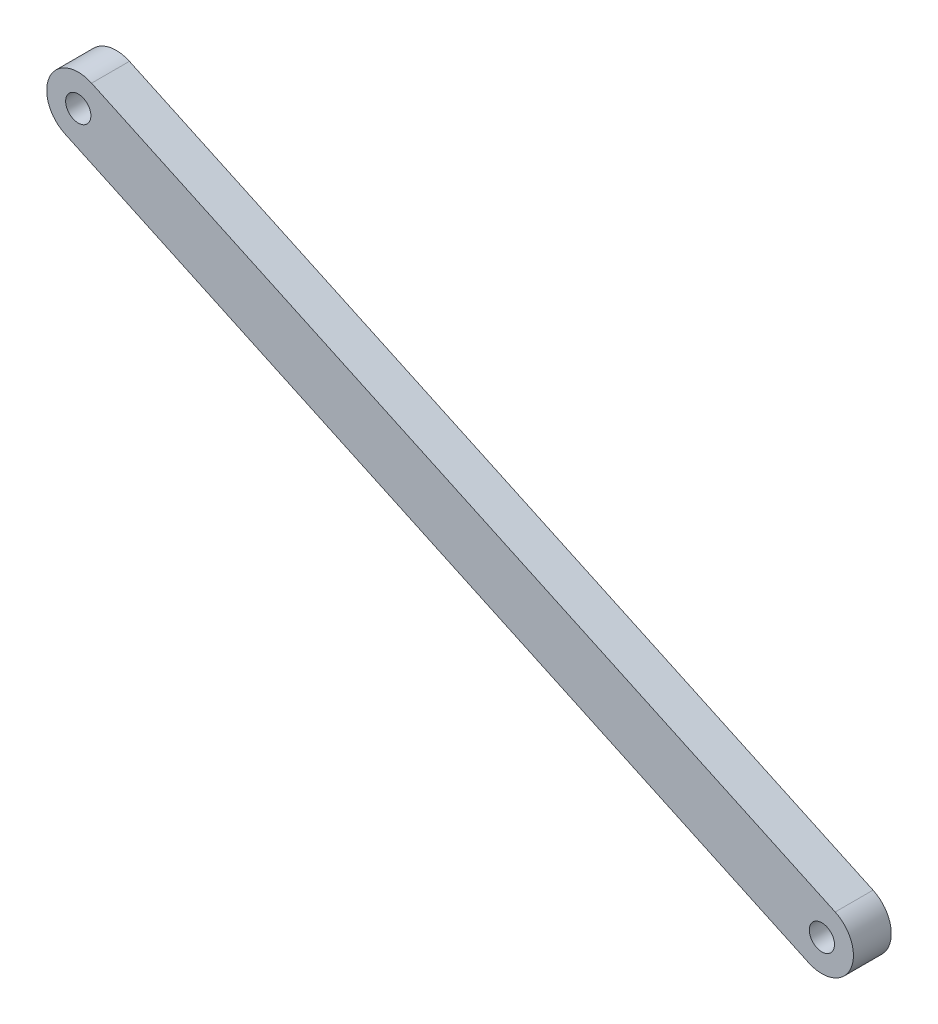
ISO-10303-21;
HEADER;
FILE_DESCRIPTION(('STEP AP214'),'2;1');
FILE_NAME('part.step','',(''),(''),'','','');
FILE_SCHEMA(('AUTOMOTIVE_DESIGN { 1 0 10303 214 1 1 1 1 }'));
ENDSEC;
DATA;
#1=APPLICATION_CONTEXT('core data for automotive mechanical design processes');
#2=APPLICATION_PROTOCOL_DEFINITION('international standard','automotive_design',2000,#1);
#3=PRODUCT_CONTEXT('',#1,'mechanical');
#4=PRODUCT('Part','Part','',(#3));
#5=PRODUCT_RELATED_PRODUCT_CATEGORY('part','',(#4));
#6=PRODUCT_DEFINITION_FORMATION('','',#4);
#7=PRODUCT_DEFINITION_CONTEXT('part definition',#1,'design');
#8=PRODUCT_DEFINITION('design','',#6,#7);
#9=PRODUCT_DEFINITION_SHAPE('','',#8);
#10=(LENGTH_UNIT() NAMED_UNIT(*) SI_UNIT(.MILLI.,.METRE.));
#11=(NAMED_UNIT(*) PLANE_ANGLE_UNIT() SI_UNIT($,.RADIAN.));
#12=(NAMED_UNIT(*) SI_UNIT($,.STERADIAN.) SOLID_ANGLE_UNIT());
#13=UNCERTAINTY_MEASURE_WITH_UNIT(LENGTH_MEASURE(1.E-05),#10,'distance_accuracy_value','');
#14=(GEOMETRIC_REPRESENTATION_CONTEXT(3) GLOBAL_UNCERTAINTY_ASSIGNED_CONTEXT((#13)) GLOBAL_UNIT_ASSIGNED_CONTEXT((#10,
#11,#12)) REPRESENTATION_CONTEXT('',''));
#15=CARTESIAN_POINT('',(0.,0.,0.));
#16=DIRECTION('',(0.,0.,1.));
#17=DIRECTION('',(1.,0.,0.));
#18=AXIS2_PLACEMENT_3D('',#15,#16,#17);
#19=CARTESIAN_POINT('',(-20.6555406612858,56.1798703776775,3.));
#20=DIRECTION('',(0.,0.,1.));
#21=DIRECTION('',(1.,0.,0.));
#22=AXIS2_PLACEMENT_3D('',#19,#20,#21);
#23=PLANE('',#22);
#24=CARTESIAN_POINT('',(38.2786541053352,28.7616157430369,3.));
#25=DIRECTION('',(0.,0.,1.));
#26=DIRECTION('',(1.,0.,0.));
#27=AXIS2_PLACEMENT_3D('',#24,#25,#26);
#28=CIRCLE('',#27,0.999999999999998);
#29=CARTESIAN_POINT('',(39.2786541053352,28.7616157430369,3.));
#30=VERTEX_POINT('',#29);
#31=EDGE_CURVE('E102',#30,#30,#28,.T.);
#32=ORIENTED_EDGE('',*,*,#31,.F.);
#33=EDGE_LOOP('',(#32));
#34=FACE_BOUND('',#33,.T.);
#35=CARTESIAN_POINT('',(-20.6555406612858,56.1798703776775,3.));
#36=DIRECTION('',(0.,0.,1.));
#37=DIRECTION('',(1.,0.,0.));
#38=AXIS2_PLACEMENT_3D('',#35,#36,#37);
#39=CIRCLE('',#38,2.50000000000001);
#40=CARTESIAN_POINT('',(-19.6009924061073,58.4465701763937,3.));
#41=VERTEX_POINT('',#40);
#42=CARTESIAN_POINT('',(-21.7100889164642,53.9131705789614,3.));
#43=VERTEX_POINT('',#42);
#44=EDGE_CURVE('E87',#41,#43,#39,.T.);
#45=ORIENTED_EDGE('',*,*,#44,.T.);
#46=DIRECTION('',(0.906679919486476,-0.421819302071394,0.));
#47=VECTOR('',#46,1.);
#48=CARTESIAN_POINT('',(-21.7100889164642,53.9131705789614,3.));
#49=LINE('',#48,#47);
#50=CARTESIAN_POINT('',(37.2241058501567,26.4949159443207,3.));
#51=VERTEX_POINT('',#50);
#52=EDGE_CURVE('E82',#43,#51,#49,.T.);
#53=ORIENTED_EDGE('',*,*,#52,.T.);
#54=CARTESIAN_POINT('',(38.2786541053352,28.7616157430369,3.));
#55=DIRECTION('',(0.,0.,1.));
#56=DIRECTION('',(1.,0.,0.));
#57=AXIS2_PLACEMENT_3D('',#54,#55,#56);
#58=CIRCLE('',#57,2.50000000000001);
#59=CARTESIAN_POINT('',(39.3332023605137,31.0283155417531,3.));
#60=VERTEX_POINT('',#59);
#61=EDGE_CURVE('E85',#51,#60,#58,.T.);
#62=ORIENTED_EDGE('',*,*,#61,.T.);
#63=DIRECTION('',(-0.906679919486476,0.421819302071394,0.));
#64=VECTOR('',#63,1.);
#65=CARTESIAN_POINT('',(-19.6009924061073,58.4465701763937,3.));
#66=LINE('',#65,#64);
#67=EDGE_CURVE('E52',#60,#41,#66,.T.);
#68=ORIENTED_EDGE('',*,*,#67,.T.);
#69=EDGE_LOOP('',(#45,#53,#62,#68));
#70=FACE_BOUND('',#69,.T.);
#71=CARTESIAN_POINT('',(-20.6555406612858,56.1798703776775,3.));
#72=DIRECTION('',(0.,0.,1.));
#73=DIRECTION('',(1.,0.,0.));
#74=AXIS2_PLACEMENT_3D('',#71,#72,#73);
#75=CIRCLE('',#74,0.999999999999998);
#76=CARTESIAN_POINT('',(-19.6555406612858,56.1798703776775,3.));
#77=VERTEX_POINT('',#76);
#78=EDGE_CURVE('E117',#77,#77,#75,.T.);
#79=ORIENTED_EDGE('',*,*,#78,.F.);
#80=EDGE_LOOP('',(#79));
#81=FACE_BOUND('',#80,.T.);
#82=ADVANCED_FACE('F35',(#34,#70,#81),#23,.T.);
#83=CARTESIAN_POINT('',(-20.6555406612858,56.1798703776775,0.));
#84=DIRECTION('',(0.,0.,1.));
#85=DIRECTION('',(1.,0.,0.));
#86=AXIS2_PLACEMENT_3D('',#83,#84,#85);
#87=PLANE('',#86);
#88=CARTESIAN_POINT('',(-20.6555406612858,56.1798703776775,0.));
#89=DIRECTION('',(0.,0.,1.));
#90=DIRECTION('',(1.,0.,0.));
#91=AXIS2_PLACEMENT_3D('',#88,#89,#90);
#92=CIRCLE('',#91,2.50000000000001);
#93=CARTESIAN_POINT('',(-19.6009924061073,58.4465701763937,0.));
#94=VERTEX_POINT('',#93);
#95=CARTESIAN_POINT('',(-21.7100889164642,53.9131705789614,0.));
#96=VERTEX_POINT('',#95);
#97=EDGE_CURVE('E99',#94,#96,#92,.T.);
#98=ORIENTED_EDGE('',*,*,#97,.F.);
#99=DIRECTION('',(-0.906679919486476,0.421819302071394,0.));
#100=VECTOR('',#99,1.);
#101=CARTESIAN_POINT('',(-19.6009924061073,58.4465701763937,0.));
#102=LINE('',#101,#100);
#103=CARTESIAN_POINT('',(39.3332023605137,31.0283155417531,0.));
#104=VERTEX_POINT('',#103);
#105=EDGE_CURVE('E75',#104,#94,#102,.T.);
#106=ORIENTED_EDGE('',*,*,#105,.F.);
#107=CARTESIAN_POINT('',(38.2786541053352,28.7616157430369,0.));
#108=DIRECTION('',(0.,0.,1.));
#109=DIRECTION('',(1.,0.,0.));
#110=AXIS2_PLACEMENT_3D('',#107,#108,#109);
#111=CIRCLE('',#110,2.50000000000001);
#112=CARTESIAN_POINT('',(37.2241058501567,26.4949159443207,0.));
#113=VERTEX_POINT('',#112);
#114=EDGE_CURVE('E69',#113,#104,#111,.T.);
#115=ORIENTED_EDGE('',*,*,#114,.F.);
#116=DIRECTION('',(0.906679919486476,-0.421819302071394,0.));
#117=VECTOR('',#116,1.);
#118=CARTESIAN_POINT('',(-21.7100889164642,53.9131705789614,0.));
#119=LINE('',#118,#117);
#120=EDGE_CURVE('E91',#96,#113,#119,.T.);
#121=ORIENTED_EDGE('',*,*,#120,.F.);
#122=EDGE_LOOP('',(#98,#106,#115,#121));
#123=FACE_BOUND('',#122,.T.);
#124=CARTESIAN_POINT('',(38.2786541053352,28.7616157430369,0.));
#125=DIRECTION('',(0.,0.,1.));
#126=DIRECTION('',(1.,0.,0.));
#127=AXIS2_PLACEMENT_3D('',#124,#125,#126);
#128=CIRCLE('',#127,0.999999999999998);
#129=CARTESIAN_POINT('',(39.2786541053352,28.7616157430369,0.));
#130=VERTEX_POINT('',#129);
#131=EDGE_CURVE('E114',#130,#130,#128,.T.);
#132=ORIENTED_EDGE('',*,*,#131,.T.);
#133=EDGE_LOOP('',(#132));
#134=FACE_BOUND('',#133,.T.);
#135=CARTESIAN_POINT('',(-20.6555406612858,56.1798703776775,0.));
#136=DIRECTION('',(0.,0.,1.));
#137=DIRECTION('',(1.,0.,0.));
#138=AXIS2_PLACEMENT_3D('',#135,#136,#137);
#139=CIRCLE('',#138,0.999999999999998);
#140=CARTESIAN_POINT('',(-19.6555406612858,56.1798703776775,0.));
#141=VERTEX_POINT('',#140);
#142=EDGE_CURVE('E120',#141,#141,#139,.T.);
#143=ORIENTED_EDGE('',*,*,#142,.T.);
#144=EDGE_LOOP('',(#143));
#145=FACE_BOUND('',#144,.T.);
#146=ADVANCED_FACE('F110',(#123,#134,#145),#87,.F.);
#147=CARTESIAN_POINT('',(-20.6555406612858,56.1798703776775,3.));
#148=DIRECTION('',(0.,0.,-1.));
#149=DIRECTION('',(-1.,0.,0.));
#150=AXIS2_PLACEMENT_3D('',#147,#148,#149);
#151=CYLINDRICAL_SURFACE('',#150,2.50000000000001);
#152=ORIENTED_EDGE('',*,*,#97,.T.);
#153=DIRECTION('',(0.,0.,-1.));
#154=VECTOR('',#153,1.);
#155=CARTESIAN_POINT('',(-21.7100889164642,53.9131705789614,3.));
#156=LINE('',#155,#154);
#157=EDGE_CURVE('E11',#43,#96,#156,.T.);
#158=ORIENTED_EDGE('',*,*,#157,.F.);
#159=ORIENTED_EDGE('',*,*,#44,.F.);
#160=DIRECTION('',(0.,0.,-1.));
#161=VECTOR('',#160,1.);
#162=CARTESIAN_POINT('',(-19.6009924061073,58.4465701763937,3.));
#163=LINE('',#162,#161);
#164=EDGE_CURVE('E95',#41,#94,#163,.T.);
#165=ORIENTED_EDGE('',*,*,#164,.T.);
#166=EDGE_LOOP('',(#152,#158,#159,#165));
#167=FACE_BOUND('',#166,.T.);
#168=ADVANCED_FACE('F37',(#167),#151,.T.);
#169=CARTESIAN_POINT('',(-21.7100889164642,53.9131705789614,3.));
#170=DIRECTION('',(0.421819302071394,0.906679919486476,0.));
#171=DIRECTION('',(-0.906679919486476,0.421819302071394,0.));
#172=AXIS2_PLACEMENT_3D('',#169,#170,#171);
#173=PLANE('',#172);
#174=ORIENTED_EDGE('',*,*,#120,.T.);
#175=DIRECTION('',(0.,0.,-1.));
#176=VECTOR('',#175,1.);
#177=CARTESIAN_POINT('',(37.2241058501567,26.4949159443207,3.));
#178=LINE('',#177,#176);
#179=EDGE_CURVE('E44',#51,#113,#178,.T.);
#180=ORIENTED_EDGE('',*,*,#179,.F.);
#181=ORIENTED_EDGE('',*,*,#52,.F.);
#182=ORIENTED_EDGE('',*,*,#157,.T.);
#183=EDGE_LOOP('',(#174,#180,#181,#182));
#184=FACE_BOUND('',#183,.T.);
#185=ADVANCED_FACE('F90',(#184),#173,.F.);
#186=CARTESIAN_POINT('',(38.2786541053352,28.7616157430369,3.));
#187=DIRECTION('',(0.,0.,-1.));
#188=DIRECTION('',(-1.,0.,0.));
#189=AXIS2_PLACEMENT_3D('',#186,#187,#188);
#190=CYLINDRICAL_SURFACE('',#189,2.50000000000001);
#191=ORIENTED_EDGE('',*,*,#114,.T.);
#192=DIRECTION('',(0.,0.,-1.));
#193=VECTOR('',#192,1.);
#194=CARTESIAN_POINT('',(39.3332023605137,31.0283155417531,3.));
#195=LINE('',#194,#193);
#196=EDGE_CURVE('E92',#60,#104,#195,.T.);
#197=ORIENTED_EDGE('',*,*,#196,.F.);
#198=ORIENTED_EDGE('',*,*,#61,.F.);
#199=ORIENTED_EDGE('',*,*,#179,.T.);
#200=EDGE_LOOP('',(#191,#197,#198,#199));
#201=FACE_BOUND('',#200,.T.);
#202=ADVANCED_FACE('F93',(#201),#190,.T.);
#203=CARTESIAN_POINT('',(-19.6009924061073,58.4465701763937,3.));
#204=DIRECTION('',(-0.421819302071394,-0.906679919486476,0.));
#205=DIRECTION('',(0.906679919486476,-0.421819302071394,0.));
#206=AXIS2_PLACEMENT_3D('',#203,#204,#205);
#207=PLANE('',#206);
#208=ORIENTED_EDGE('',*,*,#105,.T.);
#209=ORIENTED_EDGE('',*,*,#164,.F.);
#210=ORIENTED_EDGE('',*,*,#67,.F.);
#211=ORIENTED_EDGE('',*,*,#196,.T.);
#212=EDGE_LOOP('',(#208,#209,#210,#211));
#213=FACE_BOUND('',#212,.T.);
#214=ADVANCED_FACE('F107',(#213),#207,.F.);
#215=CARTESIAN_POINT('',(38.2786541053352,28.7616157430369,3.));
#216=DIRECTION('',(0.,0.,-1.));
#217=DIRECTION('',(-1.,0.,0.));
#218=AXIS2_PLACEMENT_3D('',#215,#216,#217);
#219=CYLINDRICAL_SURFACE('',#218,0.999999999999998);
#220=ORIENTED_EDGE('',*,*,#31,.T.);
#221=EDGE_LOOP('',(#220));
#222=FACE_BOUND('',#221,.T.);
#223=ORIENTED_EDGE('',*,*,#131,.F.);
#224=EDGE_LOOP('',(#223));
#225=FACE_BOUND('',#224,.T.);
#226=ADVANCED_FACE('F137',(#222,#225),#219,.F.);
#227=CARTESIAN_POINT('',(-20.6555406612858,56.1798703776775,3.));
#228=DIRECTION('',(0.,0.,-1.));
#229=DIRECTION('',(-1.,0.,0.));
#230=AXIS2_PLACEMENT_3D('',#227,#228,#229);
#231=CYLINDRICAL_SURFACE('',#230,0.999999999999998);
#232=ORIENTED_EDGE('',*,*,#78,.T.);
#233=EDGE_LOOP('',(#232));
#234=FACE_BOUND('',#233,.T.);
#235=ORIENTED_EDGE('',*,*,#142,.F.);
#236=EDGE_LOOP('',(#235));
#237=FACE_BOUND('',#236,.T.);
#238=ADVANCED_FACE('F126',(#234,#237),#231,.F.);
#239=CLOSED_SHELL('',(#82,#146,#168,#185,#202,#214,#226,#238));
#240=MANIFOLD_SOLID_BREP('B2',#239);
#241=ADVANCED_BREP_SHAPE_REPRESENTATION('',(#18,#240),#14);
#242=SHAPE_DEFINITION_REPRESENTATION(#9,#241);
ENDSEC;
END-ISO-10303-21;
